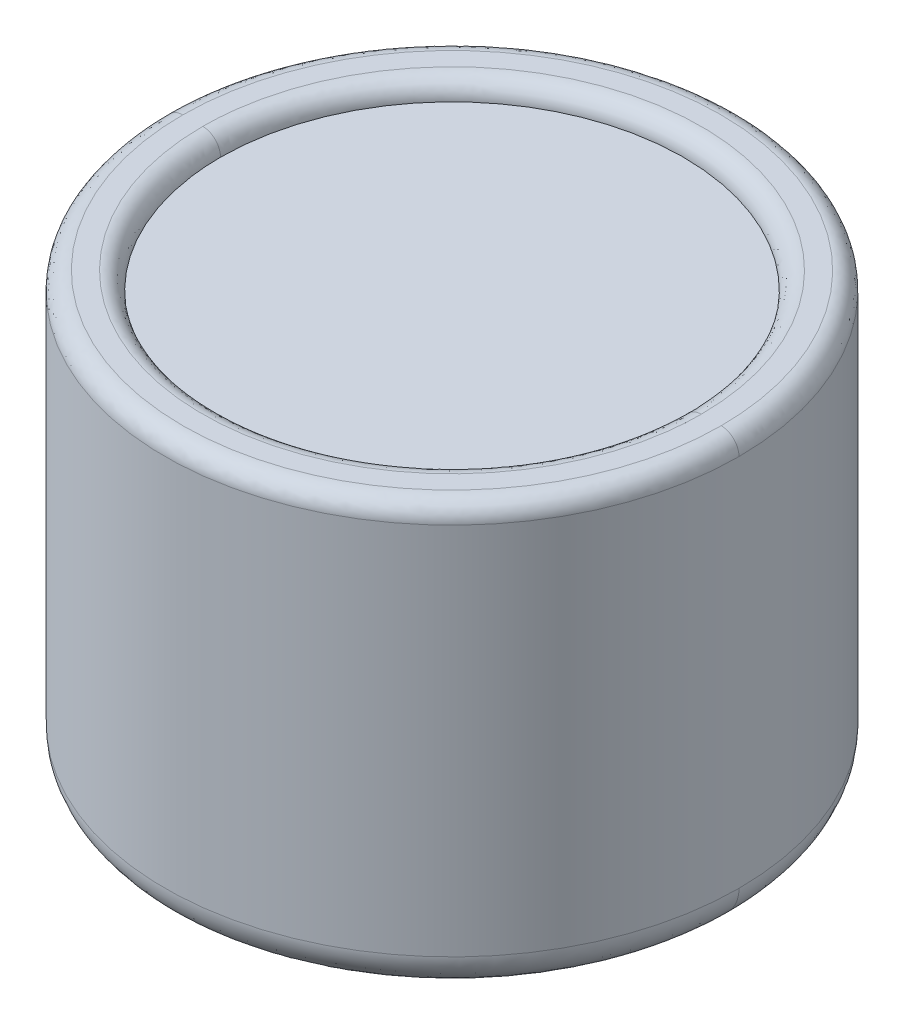
ISO-10303-21;
HEADER;
FILE_DESCRIPTION(('STEP AP214'),'2;1');
FILE_NAME('part.step','',(''),(''),'','','');
FILE_SCHEMA(('AUTOMOTIVE_DESIGN { 1 0 10303 214 1 1 1 1 }'));
ENDSEC;
DATA;
#1=APPLICATION_CONTEXT('core data for automotive mechanical design processes');
#2=APPLICATION_PROTOCOL_DEFINITION('international standard','automotive_design',2000,#1);
#3=PRODUCT_CONTEXT('',#1,'mechanical');
#4=PRODUCT('Part','Part','',(#3));
#5=PRODUCT_RELATED_PRODUCT_CATEGORY('part','',(#4));
#6=PRODUCT_DEFINITION_FORMATION('','',#4);
#7=PRODUCT_DEFINITION_CONTEXT('part definition',#1,'design');
#8=PRODUCT_DEFINITION('design','',#6,#7);
#9=PRODUCT_DEFINITION_SHAPE('','',#8);
#10=(LENGTH_UNIT() NAMED_UNIT(*) SI_UNIT(.MILLI.,.METRE.));
#11=(NAMED_UNIT(*) PLANE_ANGLE_UNIT() SI_UNIT($,.RADIAN.));
#12=(NAMED_UNIT(*) SI_UNIT($,.STERADIAN.) SOLID_ANGLE_UNIT());
#13=UNCERTAINTY_MEASURE_WITH_UNIT(LENGTH_MEASURE(1.E-05),#10,'distance_accuracy_value','');
#14=(GEOMETRIC_REPRESENTATION_CONTEXT(3) GLOBAL_UNCERTAINTY_ASSIGNED_CONTEXT((#13)) GLOBAL_UNIT_ASSIGNED_CONTEXT((#10,
#11,#12)) REPRESENTATION_CONTEXT('',''));
#15=CARTESIAN_POINT('',(0.,0.,0.));
#16=DIRECTION('',(0.,0.,1.));
#17=DIRECTION('',(1.,0.,0.));
#18=AXIS2_PLACEMENT_3D('',#15,#16,#17);
#19=CARTESIAN_POINT('',(-6.578,0.,-6.578));
#20=DIRECTION('',(0.,-1.,0.));
#21=DIRECTION('',(1.,0.,0.));
#22=AXIS2_PLACEMENT_3D('',#19,#20,#21);
#23=PLANE('',#22);
#24=CARTESIAN_POINT('',(6.4999999997338,0.,0.));
#25=CARTESIAN_POINT('',(6.50001366431969,0.,0.167208964565129));
#26=CARTESIAN_POINT('',(6.49354851128327,0.,0.334415483471507));
#27=CARTESIAN_POINT('',(6.46774004786549,0.,0.668080797246167));
#28=CARTESIAN_POINT('',(6.44837770974202,0.,0.834538120950581));
#29=CARTESIAN_POINT('',(6.3965708357251,0.,1.16728617985299));
#30=CARTESIAN_POINT('',(6.363984415412,0.,1.33355484339149));
#31=CARTESIAN_POINT('',(6.28592164803399,0.,1.66308937538702));
#32=CARTESIAN_POINT('',(6.24044149478777,0.,1.82635434198662));
#33=CARTESIAN_POINT('',(6.13682589864649,0.,2.14897606958613));
#34=CARTESIAN_POINT('',(6.07867945412553,0.,2.3083292982214));
#35=CARTESIAN_POINT('',(5.95010992212837,0.,2.62200802602343));
#36=CARTESIAN_POINT('',(5.87968632487843,0.,2.77633331610347));
#37=CARTESIAN_POINT('',(5.7210337373931,0.,3.0908182979343));
#38=CARTESIAN_POINT('',(5.6318445707372,0.,3.25049465806009));
#39=CARTESIAN_POINT('',(5.44032700400565,0.,3.56177490585207));
#40=CARTESIAN_POINT('',(5.33799763986073,0.,3.7133782000583));
#41=CARTESIAN_POINT('',(5.12094953129957,0.,4.00740052136111));
#42=CARTESIAN_POINT('',(5.00623294451055,0.,4.14982114103134));
#43=CARTESIAN_POINT('',(4.76516941006333,0.,4.42454157719982));
#44=CARTESIAN_POINT('',(4.63881841517657,0.,4.55683784223949));
#45=CARTESIAN_POINT('',(4.37546686752828,0.,4.81026741192662));
#46=CARTESIAN_POINT('',(4.23847022605067,0.,4.93140478101395));
#47=CARTESIAN_POINT('',(3.95470814880093,0.,5.1617527090934));
#48=CARTESIAN_POINT('',(3.80793912427279,0.,5.27095884721201));
#49=CARTESIAN_POINT('',(3.50578095423155,0.,5.4765756894931));
#50=CARTESIAN_POINT('',(3.35039522170865,0.,5.57299140919799));
#51=CARTESIAN_POINT('',(3.03199632944103,0.,5.75242593821251));
#52=CARTESIAN_POINT('',(2.86898037490913,0.,5.83543978838135));
#53=CARTESIAN_POINT('',(2.53659430783345,0.,5.98740937566085));
#54=CARTESIAN_POINT('',(2.36722653114135,0.,6.05637022182173));
#55=CARTESIAN_POINT('',(2.02322089272366,0.,6.17980448377659));
#56=CARTESIAN_POINT('',(1.84858110857646,0.,6.23427254199765));
#57=CARTESIAN_POINT('',(1.49539585027405,0.,6.32828365118542));
#58=CARTESIAN_POINT('',(1.316851780365,0.,6.36783197784335));
#59=CARTESIAN_POINT('',(0.957000718837463,0.,6.43176156340239));
#60=CARTESIAN_POINT('',(0.775692734481893,0.,6.45613723453678));
#61=CARTESIAN_POINT('',(0.41170246336448,0.,6.48952198585472));
#62=CARTESIAN_POINT('',(0.229020445580821,0.,6.49853399880751));
#63=CARTESIAN_POINT('',(-0.136457298869431,0.,6.5011364612163));
#64=CARTESIAN_POINT('',(-0.319253027864897,0.,6.49472658368025));
#65=CARTESIAN_POINT('',(-0.683648759991206,0.,6.46653060878248));
#66=CARTESIAN_POINT('',(-0.865248801704446,0.,6.44474501004264));
#67=CARTESIAN_POINT('',(-1.22596811139239,0.,6.38595301567728));
#68=CARTESIAN_POINT('',(-1.40508737946386,0.,6.34894662064545));
#69=CARTESIAN_POINT('',(-1.75957069934756,0.,6.25997638048395));
#70=CARTESIAN_POINT('',(-1.93493477336985,0.,6.20801262384574));
#71=CARTESIAN_POINT('',(-2.28065841955868,0.,6.08949826393411));
#72=CARTESIAN_POINT('',(-2.45101809772229,0.,6.02294796986811));
#73=CARTESIAN_POINT('',(-2.7855675772887,0.,5.87571457987039));
#74=CARTESIAN_POINT('',(-2.94975582870701,0.,5.79502796195797));
#75=CARTESIAN_POINT('',(-3.27069065191145,0.,5.62013938623208));
#76=CARTESIAN_POINT('',(-3.42743993912165,0.,5.52594241136068));
#77=CARTESIAN_POINT('',(-3.73250836581121,0.,5.32464007417811));
#78=CARTESIAN_POINT('',(-3.88082411323613,0.,5.21752957121022));
#79=CARTESIAN_POINT('',(-4.16784964854144,0.,4.99123385434547));
#80=CARTESIAN_POINT('',(-4.30656296173745,0.,4.8720531117676));
#81=CARTESIAN_POINT('',(-4.57349163315597,0.,4.62239949963694));
#82=CARTESIAN_POINT('',(-4.70170432882201,0.,4.49192378325449));
#83=CARTESIAN_POINT('',(-4.94663560166544,0.,4.22068412626734));
#84=CARTESIAN_POINT('',(-5.06335840476437,0.,4.07992400165001));
#85=CARTESIAN_POINT('',(-5.28457800688235,0.,3.7890156994121));
#86=CARTESIAN_POINT('',(-5.38906995183966,0.,3.63886383051852));
#87=CARTESIAN_POINT('',(-5.58499494769155,0.,3.33034699835645));
#88=CARTESIAN_POINT('',(-5.67643281962272,0.,3.17198509676554));
#89=CARTESIAN_POINT('',(-5.84568358745117,0.,2.84805090807281));
#90=CARTESIAN_POINT('',(-5.92349035236186,0.,2.68247541804392));
#91=CARTESIAN_POINT('',(-6.06484826654077,0.,2.34542047929095));
#92=CARTESIAN_POINT('',(-6.12840505410139,0.,2.17394339674015));
#93=CARTESIAN_POINT('',(-6.23675923987154,0.,1.83889698005937));
#94=CARTESIAN_POINT('',(-6.28258453042371,0.,1.67565906014286));
#95=CARTESIAN_POINT('',(-6.36134371919622,0.,1.34610837061257));
#96=CARTESIAN_POINT('',(-6.39427831019976,0.,1.17979576674434));
#97=CARTESIAN_POINT('',(-6.44705407283991,0.,0.845094999023157));
#98=CARTESIAN_POINT('',(-6.46689433202487,0.,0.676706691361722));
#99=CARTESIAN_POINT('',(-6.49337511529671,0.,0.338879764214729));
#100=CARTESIAN_POINT('',(-6.500014401423,0.,0.169441047718414));
#101=CARTESIAN_POINT('',(-6.4999999997338,0.,0.));
#102=B_SPLINE_CURVE_WITH_KNOTS('',3,(#24,#25,#26,#27,#28,#29,#30,#31,#32,#33,#34,#35,#36,#37,
#38,#39,#40,#41,#42,#43,#44,#45,#46,#47,#48,#49,#50,#51,#52,#53,#54,#55,#56,#57,#58,#59,#60,#61,
#62,#63,#64,#65,#66,#67,#68,#69,#70,#71,#72,#73,#74,#75,#76,#77,#78,#79,#80,#81,#82,#83,#84,#85,
#86,#87,#88,#89,#90,#91,#92,#93,#94,#95,#96,#97,#98,#99,#100,#101),.UNSPECIFIED.,.F.,.F.,(4,2,2,
2,2,2,2,2,2,2,2,2,2,2,2,2,2,2,2,2,2,2,2,2,2,2,2,2,2,2,2,2,2,2,2,2,2,2,4),(0.,0.50149818635042,
1.0037378970121,1.51151506612574,2.01944228550024,2.5278124495479,3.03620372724625,
3.58423558241575,4.13230766855352,4.68028444409916,5.22845256816133,5.77642023516014,
6.32459025665536,6.87254468327879,7.42070140894743,7.96865849215657,8.51681785902234,
9.06478321192487,9.61295024961197,10.1610126359527,10.709086643023,11.2571428773242,
11.8051990902483,12.3532520608027,12.9012934147786,13.4494715046606,13.9974479308252,
14.5456432218957,15.0936361762939,15.641767653385,16.1896967714184,16.7378426140704,
17.2857854928316,17.8339741956059,18.3819456121217,18.8900794611449,19.3981859978455,
19.9063279371706,20.4145175267733),.UNSPECIFIED.);
#103=CARTESIAN_POINT('',(6.4999999997338,0.,0.));
#104=VERTEX_POINT('',#103);
#105=CARTESIAN_POINT('',(-6.4999999997338,2.78870829823793E-10,0.));
#106=VERTEX_POINT('',#105);
#107=EDGE_CURVE('E72',#104,#106,#102,.T.);
#108=ORIENTED_EDGE('',*,*,#107,.F.);
#109=CARTESIAN_POINT('',(-6.4999999997338,0.,0.));
#110=CARTESIAN_POINT('',(-6.50001366431969,0.,-0.167208964565129));
#111=CARTESIAN_POINT('',(-6.49354851128327,0.,-0.334415483471507));
#112=CARTESIAN_POINT('',(-6.46774004786549,0.,-0.668080797246167));
#113=CARTESIAN_POINT('',(-6.44837770974202,0.,-0.834538120950581));
#114=CARTESIAN_POINT('',(-6.3965708357251,0.,-1.16728617985299));
#115=CARTESIAN_POINT('',(-6.363984415412,0.,-1.33355484339149));
#116=CARTESIAN_POINT('',(-6.28592164803399,0.,-1.66308937538702));
#117=CARTESIAN_POINT('',(-6.24044149478777,0.,-1.82635434198662));
#118=CARTESIAN_POINT('',(-6.13682589864649,0.,-2.14897606958613));
#119=CARTESIAN_POINT('',(-6.07867945412553,0.,-2.3083292982214));
#120=CARTESIAN_POINT('',(-5.95010992212837,0.,-2.62200802602343));
#121=CARTESIAN_POINT('',(-5.87968632487843,0.,-2.77633331610347));
#122=CARTESIAN_POINT('',(-5.7210337373931,0.,-3.0908182979343));
#123=CARTESIAN_POINT('',(-5.6318445707372,0.,-3.25049465806009));
#124=CARTESIAN_POINT('',(-5.44032700400565,0.,-3.56177490585207));
#125=CARTESIAN_POINT('',(-5.33799763986073,0.,-3.7133782000583));
#126=CARTESIAN_POINT('',(-5.12094953129957,0.,-4.00740052136111));
#127=CARTESIAN_POINT('',(-5.00623294451055,0.,-4.14982114103134));
#128=CARTESIAN_POINT('',(-4.76516941006333,0.,-4.42454157719982));
#129=CARTESIAN_POINT('',(-4.63881841517657,0.,-4.55683784223949));
#130=CARTESIAN_POINT('',(-4.37546686752828,0.,-4.81026741192662));
#131=CARTESIAN_POINT('',(-4.23847022605067,0.,-4.93140478101395));
#132=CARTESIAN_POINT('',(-3.95470814880093,0.,-5.1617527090934));
#133=CARTESIAN_POINT('',(-3.80793912427279,0.,-5.27095884721201));
#134=CARTESIAN_POINT('',(-3.50578095423155,0.,-5.4765756894931));
#135=CARTESIAN_POINT('',(-3.35039522170865,0.,-5.57299140919799));
#136=CARTESIAN_POINT('',(-3.03199632944103,0.,-5.75242593821251));
#137=CARTESIAN_POINT('',(-2.86898037490913,0.,-5.83543978838135));
#138=CARTESIAN_POINT('',(-2.53659430783345,0.,-5.98740937566085));
#139=CARTESIAN_POINT('',(-2.36722653114135,0.,-6.05637022182173));
#140=CARTESIAN_POINT('',(-2.02322089272366,0.,-6.17980448377659));
#141=CARTESIAN_POINT('',(-1.84858110857646,0.,-6.23427254199765));
#142=CARTESIAN_POINT('',(-1.49539585027405,0.,-6.32828365118542));
#143=CARTESIAN_POINT('',(-1.316851780365,0.,-6.36783197784335));
#144=CARTESIAN_POINT('',(-0.957000718837463,0.,-6.43176156340239));
#145=CARTESIAN_POINT('',(-0.775692734481893,0.,-6.45613723453678));
#146=CARTESIAN_POINT('',(-0.41170246336448,0.,-6.48952198585472));
#147=CARTESIAN_POINT('',(-0.229020445580821,0.,-6.49853399880751));
#148=CARTESIAN_POINT('',(0.136457298869431,0.,-6.5011364612163));
#149=CARTESIAN_POINT('',(0.319253027864897,0.,-6.49472658368025));
#150=CARTESIAN_POINT('',(0.683648759991206,0.,-6.46653060878248));
#151=CARTESIAN_POINT('',(0.865248801704446,0.,-6.44474501004264));
#152=CARTESIAN_POINT('',(1.22596811139239,0.,-6.38595301567728));
#153=CARTESIAN_POINT('',(1.40508737946386,0.,-6.34894662064545));
#154=CARTESIAN_POINT('',(1.75957069934756,0.,-6.25997638048395));
#155=CARTESIAN_POINT('',(1.93493477336985,0.,-6.20801262384574));
#156=CARTESIAN_POINT('',(2.28065841955868,0.,-6.08949826393411));
#157=CARTESIAN_POINT('',(2.45101809772229,0.,-6.02294796986811));
#158=CARTESIAN_POINT('',(2.7855675772887,0.,-5.87571457987039));
#159=CARTESIAN_POINT('',(2.94975582870701,0.,-5.79502796195797));
#160=CARTESIAN_POINT('',(3.27069065191145,0.,-5.62013938623208));
#161=CARTESIAN_POINT('',(3.42743993912165,0.,-5.52594241136068));
#162=CARTESIAN_POINT('',(3.73250836581121,0.,-5.32464007417811));
#163=CARTESIAN_POINT('',(3.88082411323613,0.,-5.21752957121022));
#164=CARTESIAN_POINT('',(4.16784964854144,0.,-4.99123385434547));
#165=CARTESIAN_POINT('',(4.30656296173745,0.,-4.8720531117676));
#166=CARTESIAN_POINT('',(4.57349163315597,0.,-4.62239949963694));
#167=CARTESIAN_POINT('',(4.70170432882201,0.,-4.49192378325449));
#168=CARTESIAN_POINT('',(4.94663560166544,0.,-4.22068412626734));
#169=CARTESIAN_POINT('',(5.06335840476437,0.,-4.07992400165001));
#170=CARTESIAN_POINT('',(5.28457800688235,0.,-3.7890156994121));
#171=CARTESIAN_POINT('',(5.38906995183966,0.,-3.63886383051852));
#172=CARTESIAN_POINT('',(5.58499494769155,0.,-3.33034699835645));
#173=CARTESIAN_POINT('',(5.67643281962272,0.,-3.17198509676554));
#174=CARTESIAN_POINT('',(5.84568358745117,0.,-2.84805090807281));
#175=CARTESIAN_POINT('',(5.92349035236186,0.,-2.68247541804392));
#176=CARTESIAN_POINT('',(6.06484826654077,0.,-2.34542047929095));
#177=CARTESIAN_POINT('',(6.12840505410139,0.,-2.17394339674015));
#178=CARTESIAN_POINT('',(6.23675923987154,0.,-1.83889698005937));
#179=CARTESIAN_POINT('',(6.28258453042371,0.,-1.67565906014286));
#180=CARTESIAN_POINT('',(6.36134371919622,0.,-1.34610837061257));
#181=CARTESIAN_POINT('',(6.39427831019976,0.,-1.17979576674434));
#182=CARTESIAN_POINT('',(6.44705407283991,0.,-0.845094999023157));
#183=CARTESIAN_POINT('',(6.46689433202487,0.,-0.676706691361722));
#184=CARTESIAN_POINT('',(6.49337511529671,0.,-0.338879764214729));
#185=CARTESIAN_POINT('',(6.500014401423,0.,-0.169441047718414));
#186=CARTESIAN_POINT('',(6.4999999997338,0.,0.));
#187=B_SPLINE_CURVE_WITH_KNOTS('',3,(#109,#110,#111,#112,#113,#114,#115,#116,#117,#118,#119,
#120,#121,#122,#123,#124,#125,#126,#127,#128,#129,#130,#131,#132,#133,#134,#135,#136,#137,#138,
#139,#140,#141,#142,#143,#144,#145,#146,#147,#148,#149,#150,#151,#152,#153,#154,#155,#156,#157,
#158,#159,#160,#161,#162,#163,#164,#165,#166,#167,#168,#169,#170,#171,#172,#173,#174,#175,#176,
#177,#178,#179,#180,#181,#182,#183,#184,#185,#186),.UNSPECIFIED.,.F.,.F.,(4,2,2,2,2,2,2,2,2,2,2,
2,2,2,2,2,2,2,2,2,2,2,2,2,2,2,2,2,2,2,2,2,2,2,2,2,2,2,4),(0.,0.50149818635042,1.0037378970121,
1.51151506612574,2.01944228550024,2.5278124495479,3.03620372724625,3.58423558241575,
4.13230766855352,4.68028444409916,5.22845256816133,5.77642023516014,6.32459025665536,
6.87254468327879,7.42070140894743,7.96865849215657,8.51681785902234,9.06478321192487,
9.61295024961197,10.1610126359527,10.709086643023,11.2571428773242,11.8051990902483,
12.3532520608027,12.9012934147786,13.4494715046606,13.9974479308252,14.5456432218957,
15.0936361762939,15.641767653385,16.1896967714184,16.7378426140704,17.2857854928316,
17.8339741956059,18.3819456121217,18.8900794611449,19.3981859978455,19.9063279371706,
20.4145175267733),.UNSPECIFIED.);
#188=EDGE_CURVE('E20',#106,#104,#187,.T.);
#189=ORIENTED_EDGE('',*,*,#188,.F.);
#190=EDGE_LOOP('',(#108,#189));
#191=FACE_BOUND('',#190,.T.);
#192=ADVANCED_FACE('F16',(#191),#23,.F.);
#193=CARTESIAN_POINT('',(-7.049916708,0.497502083,0.));
#194=CARTESIAN_POINT('',(-7.049916708,0.497502083,-14.099833417));
#195=CARTESIAN_POINT('',(7.049916708,0.497502083,-14.099833417));
#196=CARTESIAN_POINT('',(7.049916708,0.497502083,0.));
#197=CARTESIAN_POINT('',(-6.709973117,0.531610211,0.));
#198=CARTESIAN_POINT('',(-6.709973117,0.531610211,-13.419946235));
#199=CARTESIAN_POINT('',(6.709973117,0.531610211,-13.419946235));
#200=CARTESIAN_POINT('',(6.709973117,0.531610211,0.));
#201=CARTESIAN_POINT('',(-6.468389789,0.290026883,0.));
#202=CARTESIAN_POINT('',(-6.468389789,0.290026883,-12.936779577));
#203=CARTESIAN_POINT('',(6.468389789,0.290026883,-12.936779577));
#204=CARTESIAN_POINT('',(6.468389789,0.290026883,0.));
#205=CARTESIAN_POINT('',(-6.502497917,-0.049916708,0.));
#206=CARTESIAN_POINT('',(-6.502497917,-0.049916708,-13.004995835));
#207=CARTESIAN_POINT('',(6.502497917,-0.049916708,-13.004995835));
#208=CARTESIAN_POINT('',(6.502497917,-0.049916708,0.));
#209=(BOUNDED_SURFACE() B_SPLINE_SURFACE(3,3,((#193,#194,#195,#196),(#197,#198,#199,#200),(#201,
#202,#203,#204),(#205,#206,#207,#208)),.UNSPECIFIED.,.F.,.F.,
.F.) B_SPLINE_SURFACE_WITH_KNOTS((4,4),(4,4),(0.,1.),(0.,1.),
.UNSPECIFIED.) GEOMETRIC_REPRESENTATION_ITEM() RATIONAL_B_SPLINE_SURFACE(((1.,0.333333333333333,
0.333333333333333,1.),(0.755320871117972,0.251773623705991,0.251773623705991,0.755320871117972),
(0.755320871117972,0.251773623705991,0.251773623705991,0.755320871117972),(1.,0.333333333333333,
0.333333333333333,1.))) REPRESENTATION_ITEM('') SURFACE());
#210=CARTESIAN_POINT('',(7.049916708,0.497502083,0.));
#211=CARTESIAN_POINT('',(6.709973117,0.531610211,0.));
#212=CARTESIAN_POINT('',(6.468389789,0.290026883,0.));
#213=CARTESIAN_POINT('',(6.502497917,-0.049916708,0.));
#214=(BOUNDED_CURVE() B_SPLINE_CURVE(3,(#210,#211,#212,#213),.UNSPECIFIED.,.F.,
.F.) B_SPLINE_CURVE_WITH_KNOTS((4,4),(0.,1.),
.UNSPECIFIED.) CURVE() GEOMETRIC_REPRESENTATION_ITEM() RATIONAL_B_SPLINE_CURVE((1.,
0.755320871117972,0.755320871117972,1.)) REPRESENTATION_ITEM(''));
#215=CARTESIAN_POINT('',(7.00000000225801,0.500000000159717,0.));
#216=VERTEX_POINT('',#215);
#217=EDGE_CURVE('E79',#216,#104,#214,.T.);
#218=CARTESIAN_POINT('',(6.99999999919493,0.500000000266195,0.));
#219=CARTESIAN_POINT('',(6.99999999919493,0.500000000266195,-13.9999999993722));
#220=CARTESIAN_POINT('',(-6.99999999919493,0.500000000266195,-13.9999999993722));
#221=CARTESIAN_POINT('',(-6.99999999919493,0.500000000266195,0.));
#222=(BOUNDED_CURVE() B_SPLINE_CURVE(3,(#218,#219,#220,#221),.UNSPECIFIED.,.F.,
.F.) B_SPLINE_CURVE_WITH_KNOTS((4,4),(0.,1.),
.UNSPECIFIED.) CURVE() GEOMETRIC_REPRESENTATION_ITEM() RATIONAL_B_SPLINE_CURVE((0.956578301969994,
0.318859433989998,0.318859433989998,0.956578301969994)) REPRESENTATION_ITEM(''));
#223=CARTESIAN_POINT('',(-7.00000000225801,0.500000000159717,0.));
#224=VERTEX_POINT('',#223);
#225=EDGE_CURVE('E86',#216,#224,#222,.T.);
#226=CARTESIAN_POINT('',(-7.049916708,0.497502083,0.));
#227=CARTESIAN_POINT('',(-6.709973117,0.531610211,0.));
#228=CARTESIAN_POINT('',(-6.468389789,0.290026883,0.));
#229=CARTESIAN_POINT('',(-6.502497917,-0.049916708,0.));
#230=(BOUNDED_CURVE() B_SPLINE_CURVE(3,(#226,#227,#228,#229),.UNSPECIFIED.,.F.,
.F.) B_SPLINE_CURVE_WITH_KNOTS((4,4),(0.,1.),
.UNSPECIFIED.) CURVE() GEOMETRIC_REPRESENTATION_ITEM() RATIONAL_B_SPLINE_CURVE((1.,
0.755320871117972,0.755320871117972,1.)) REPRESENTATION_ITEM(''));
#231=EDGE_CURVE('E76',#106,#224,#230,.F.);
#232=ORIENTED_EDGE('',*,*,#217,.F.);
#233=ORIENTED_EDGE('',*,*,#225,.T.);
#234=ORIENTED_EDGE('',*,*,#231,.F.);
#235=ORIENTED_EDGE('',*,*,#188,.T.);
#236=EDGE_LOOP('',(#232,#233,#234,#235));
#237=FACE_BOUND('',#236,.T.);
#238=ADVANCED_FACE('F78',(#237),#209,.T.);
#239=CARTESIAN_POINT('',(7.049916708,0.497502083,0.));
#240=CARTESIAN_POINT('',(7.049916708,0.497502083,14.099833417));
#241=CARTESIAN_POINT('',(-7.049916708,0.497502083,14.099833417));
#242=CARTESIAN_POINT('',(-7.049916708,0.497502083,0.));
#243=CARTESIAN_POINT('',(6.709973117,0.531610211,0.));
#244=CARTESIAN_POINT('',(6.709973117,0.531610211,13.419946235));
#245=CARTESIAN_POINT('',(-6.709973117,0.531610211,13.419946235));
#246=CARTESIAN_POINT('',(-6.709973117,0.531610211,0.));
#247=CARTESIAN_POINT('',(6.468389789,0.290026883,0.));
#248=CARTESIAN_POINT('',(6.468389789,0.290026883,12.936779577));
#249=CARTESIAN_POINT('',(-6.468389789,0.290026883,12.936779577));
#250=CARTESIAN_POINT('',(-6.468389789,0.290026883,0.));
#251=CARTESIAN_POINT('',(6.502497917,-0.049916708,0.));
#252=CARTESIAN_POINT('',(6.502497917,-0.049916708,13.004995835));
#253=CARTESIAN_POINT('',(-6.502497917,-0.049916708,13.004995835));
#254=CARTESIAN_POINT('',(-6.502497917,-0.049916708,0.));
#255=(BOUNDED_SURFACE() B_SPLINE_SURFACE(3,3,((#239,#240,#241,#242),(#243,#244,#245,#246),(#247,
#248,#249,#250),(#251,#252,#253,#254)),.UNSPECIFIED.,.F.,.F.,
.F.) B_SPLINE_SURFACE_WITH_KNOTS((4,4),(4,4),(0.,1.),(0.,1.),
.UNSPECIFIED.) GEOMETRIC_REPRESENTATION_ITEM() RATIONAL_B_SPLINE_SURFACE(((1.,0.333333333333333,
0.333333333333333,1.),(0.755320871117972,0.251773623705991,0.251773623705991,0.755320871117972),
(0.755320871117972,0.251773623705991,0.251773623705991,0.755320871117972),(1.,0.333333333333333,
0.333333333333333,1.))) REPRESENTATION_ITEM('') SURFACE());
#256=CARTESIAN_POINT('',(-6.99999999919493,0.500000000266195,0.));
#257=CARTESIAN_POINT('',(-6.99999999919493,0.500000000266195,13.9999999993722));
#258=CARTESIAN_POINT('',(6.99999999919493,0.500000000266195,13.9999999993722));
#259=CARTESIAN_POINT('',(6.99999999919493,0.500000000266195,0.));
#260=(BOUNDED_CURVE() B_SPLINE_CURVE(3,(#256,#257,#258,#259),.UNSPECIFIED.,.F.,
.F.) B_SPLINE_CURVE_WITH_KNOTS((4,4),(0.,1.),
.UNSPECIFIED.) CURVE() GEOMETRIC_REPRESENTATION_ITEM() RATIONAL_B_SPLINE_CURVE((0.956578301969994,
0.318859433989998,0.318859433989998,0.956578301969994)) REPRESENTATION_ITEM(''));
#261=EDGE_CURVE('E83',#224,#216,#260,.T.);
#262=ORIENTED_EDGE('',*,*,#261,.T.);
#263=ORIENTED_EDGE('',*,*,#217,.T.);
#264=ORIENTED_EDGE('',*,*,#107,.T.);
#265=ORIENTED_EDGE('',*,*,#231,.T.);
#266=EDGE_LOOP('',(#262,#263,#264,#265));
#267=FACE_BOUND('',#266,.T.);
#268=ADVANCED_FACE('F81',(#267),#255,.T.);
#269=CARTESIAN_POINT('',(-7.65072,0.5,-7.65072));
#270=DIRECTION('',(0.,-1.,0.));
#271=DIRECTION('',(1.,0.,0.));
#272=AXIS2_PLACEMENT_3D('',#269,#270,#271);
#273=PLANE('',#272);
#274=ORIENTED_EDGE('',*,*,#225,.F.);
#275=ORIENTED_EDGE('',*,*,#261,.F.);
#276=EDGE_LOOP('',(#274,#275));
#277=FACE_BOUND('',#276,.T.);
#278=CARTESIAN_POINT('',(7.56000000080507,0.500000000266195,0.));
#279=CARTESIAN_POINT('',(7.56000000080507,0.500000000266195,15.1200000006278));
#280=CARTESIAN_POINT('',(-7.56000000080507,0.500000000266195,15.1200000006278));
#281=CARTESIAN_POINT('',(-7.56000000080507,0.500000000266195,0.));
#282=(BOUNDED_CURVE() B_SPLINE_CURVE(3,(#278,#279,#280,#281),.UNSPECIFIED.,.F.,
.F.) B_SPLINE_CURVE_WITH_KNOTS((4,4),(0.,1.),
.UNSPECIFIED.) CURVE() GEOMETRIC_REPRESENTATION_ITEM() RATIONAL_B_SPLINE_CURVE((0.956578301969997,
0.318859433989999,0.318859433989999,0.956578301969997)) REPRESENTATION_ITEM(''));
#283=CARTESIAN_POINT('',(7.55999999893367,0.500000000159717,0.));
#284=VERTEX_POINT('',#283);
#285=CARTESIAN_POINT('',(-7.55999999893367,0.500000000159717,0.));
#286=VERTEX_POINT('',#285);
#287=EDGE_CURVE('E163',#284,#286,#282,.T.);
#288=ORIENTED_EDGE('',*,*,#287,.F.);
#289=CARTESIAN_POINT('',(-7.56000000080507,0.500000000266195,0.));
#290=CARTESIAN_POINT('',(-7.56000000080507,0.500000000266195,-15.1200000006278));
#291=CARTESIAN_POINT('',(7.56000000080507,0.500000000266195,-15.1200000006278));
#292=CARTESIAN_POINT('',(7.56000000080507,0.500000000266195,0.));
#293=(BOUNDED_CURVE() B_SPLINE_CURVE(3,(#289,#290,#291,#292),.UNSPECIFIED.,.F.,
.F.) B_SPLINE_CURVE_WITH_KNOTS((4,4),(0.,1.),
.UNSPECIFIED.) CURVE() GEOMETRIC_REPRESENTATION_ITEM() RATIONAL_B_SPLINE_CURVE((0.956578301969996,
0.318859433989999,0.318859433989999,0.956578301969996)) REPRESENTATION_ITEM(''));
#294=EDGE_CURVE('E151',#286,#284,#293,.T.);
#295=ORIENTED_EDGE('',*,*,#294,.F.);
#296=EDGE_LOOP('',(#288,#295));
#297=FACE_BOUND('',#296,.T.);
#298=ADVANCED_FACE('F128',(#277,#297),#273,.F.);
#299=CARTESIAN_POINT('',(-8.057502083,-0.049916708,0.));
#300=CARTESIAN_POINT('',(-8.057502083,-0.049916708,-16.115004165));
#301=CARTESIAN_POINT('',(8.057502083,-0.049916708,-16.115004165));
#302=CARTESIAN_POINT('',(8.057502083,-0.049916708,0.));
#303=CARTESIAN_POINT('',(-8.091610211,0.290026883,0.));
#304=CARTESIAN_POINT('',(-8.091610211,0.290026883,-16.183220423));
#305=CARTESIAN_POINT('',(8.091610211,0.290026883,-16.183220423));
#306=CARTESIAN_POINT('',(8.091610211,0.290026883,0.));
#307=CARTESIAN_POINT('',(-7.850026883,0.531610211,0.));
#308=CARTESIAN_POINT('',(-7.850026883,0.531610211,-15.700053765));
#309=CARTESIAN_POINT('',(7.850026883,0.531610211,-15.700053765));
#310=CARTESIAN_POINT('',(7.850026883,0.531610211,0.));
#311=CARTESIAN_POINT('',(-7.510083292,0.497502083,0.));
#312=CARTESIAN_POINT('',(-7.510083292,0.497502083,-15.020166583));
#313=CARTESIAN_POINT('',(7.510083292,0.497502083,-15.020166583));
#314=CARTESIAN_POINT('',(7.510083292,0.497502083,0.));
#315=(BOUNDED_SURFACE() B_SPLINE_SURFACE(3,3,((#299,#300,#301,#302),(#303,#304,#305,#306),(#307,
#308,#309,#310),(#311,#312,#313,#314)),.UNSPECIFIED.,.F.,.F.,
.F.) B_SPLINE_SURFACE_WITH_KNOTS((4,4),(4,4),(0.,1.),(0.,1.),
.UNSPECIFIED.) GEOMETRIC_REPRESENTATION_ITEM() RATIONAL_B_SPLINE_SURFACE(((1.,0.333333333333333,
0.333333333333333,1.),(0.755320871117972,0.251773623705991,0.251773623705991,0.755320871117972),
(0.755320871117972,0.251773623705991,0.251773623705991,0.755320871117972),(1.,0.333333333333333,
0.333333333333333,1.))) REPRESENTATION_ITEM('') SURFACE());
#316=CARTESIAN_POINT('',(8.057502083,-0.049916708,0.));
#317=CARTESIAN_POINT('',(8.091610211,0.290026883,0.));
#318=CARTESIAN_POINT('',(7.850026883,0.531610211,0.));
#319=CARTESIAN_POINT('',(7.510083292,0.497502083,0.));
#320=(BOUNDED_CURVE() B_SPLINE_CURVE(3,(#316,#317,#318,#319),.UNSPECIFIED.,.F.,
.F.) B_SPLINE_CURVE_WITH_KNOTS((4,4),(0.,1.),
.UNSPECIFIED.) CURVE() GEOMETRIC_REPRESENTATION_ITEM() RATIONAL_B_SPLINE_CURVE((1.,
0.755320871117972,0.755320871117972,1.)) REPRESENTATION_ITEM(''));
#321=CARTESIAN_POINT('',(8.06000000019965,4.18306233210587E-10,-8.26566816916785E-10));
#322=VERTEX_POINT('',#321);
#323=EDGE_CURVE('E256',#322,#284,#320,.T.);
#324=CARTESIAN_POINT('',(0.,0.,0.));
#325=DIRECTION('',(0.,1.,0.));
#326=DIRECTION('',(-1.,0.,0.));
#327=AXIS2_PLACEMENT_3D('',#324,#325,#326);
#328=CIRCLE('',#327,8.06);
#329=CARTESIAN_POINT('',(-8.06000000016637,3.48588527300774E-10,-3.61868322567794E-10));
#330=VERTEX_POINT('',#329);
#331=EDGE_CURVE('E202',#322,#330,#328,.T.);
#332=CARTESIAN_POINT('',(-8.057502083,-0.049916708,0.));
#333=CARTESIAN_POINT('',(-8.091610211,0.290026883,0.));
#334=CARTESIAN_POINT('',(-7.850026883,0.531610211,0.));
#335=CARTESIAN_POINT('',(-7.510083292,0.497502083,0.));
#336=(BOUNDED_CURVE() B_SPLINE_CURVE(3,(#332,#333,#334,#335),.UNSPECIFIED.,.F.,
.F.) B_SPLINE_CURVE_WITH_KNOTS((4,4),(0.,1.),
.UNSPECIFIED.) CURVE() GEOMETRIC_REPRESENTATION_ITEM() RATIONAL_B_SPLINE_CURVE((1.,
0.755320871117972,0.755320871117972,1.)) REPRESENTATION_ITEM(''));
#337=EDGE_CURVE('E263',#286,#330,#336,.F.);
#338=ORIENTED_EDGE('',*,*,#323,.F.);
#339=ORIENTED_EDGE('',*,*,#331,.T.);
#340=ORIENTED_EDGE('',*,*,#337,.F.);
#341=ORIENTED_EDGE('',*,*,#294,.T.);
#342=EDGE_LOOP('',(#338,#339,#340,#341));
#343=FACE_BOUND('',#342,.T.);
#344=ADVANCED_FACE('F210',(#343),#315,.T.);
#345=CARTESIAN_POINT('',(8.055004165,-10.400166583,0.));
#346=CARTESIAN_POINT('',(8.055004165,-10.400166583,-16.110008331));
#347=CARTESIAN_POINT('',(-8.055004165,-10.400166583,-16.110008331));
#348=CARTESIAN_POINT('',(-8.055004165,-10.400166583,0.));
#349=CARTESIAN_POINT('',(8.123220423,-11.080053765,0.));
#350=CARTESIAN_POINT('',(8.123220423,-11.080053765,-16.246440845));
#351=CARTESIAN_POINT('',(-8.123220423,-11.080053765,-16.246440845));
#352=CARTESIAN_POINT('',(-8.123220423,-11.080053765,0.));
#353=CARTESIAN_POINT('',(7.640053765,-11.563220423,0.));
#354=CARTESIAN_POINT('',(7.640053765,-11.563220423,-15.28010753));
#355=CARTESIAN_POINT('',(-7.640053765,-11.563220423,-15.28010753));
#356=CARTESIAN_POINT('',(-7.640053765,-11.563220423,0.));
#357=CARTESIAN_POINT('',(6.960166583,-11.495004165,0.));
#358=CARTESIAN_POINT('',(6.960166583,-11.495004165,-13.920333167));
#359=CARTESIAN_POINT('',(-6.960166583,-11.495004165,-13.920333167));
#360=CARTESIAN_POINT('',(-6.960166583,-11.495004165,0.));
#361=(BOUNDED_SURFACE() B_SPLINE_SURFACE(3,3,((#345,#346,#347,#348),(#349,#350,#351,#352),(#353,
#354,#355,#356),(#357,#358,#359,#360)),.UNSPECIFIED.,.F.,.F.,
.F.) B_SPLINE_SURFACE_WITH_KNOTS((4,4),(4,4),(0.,1.),(0.,1.),
.UNSPECIFIED.) GEOMETRIC_REPRESENTATION_ITEM() RATIONAL_B_SPLINE_SURFACE(((1.,0.333333333333333,
0.333333333333333,1.),(0.755320871117972,0.251773623705991,0.251773623705991,0.755320871117972),
(0.755320871117972,0.251773623705991,0.251773623705991,0.755320871117972),(1.,0.333333333333333,
0.333333333333333,1.))) REPRESENTATION_ITEM('') SURFACE());
#362=CARTESIAN_POINT('',(-8.055004165,-10.400166583,0.));
#363=CARTESIAN_POINT('',(-8.123220423,-11.080053765,0.));
#364=CARTESIAN_POINT('',(-7.640053765,-11.563220423,0.));
#365=CARTESIAN_POINT('',(-6.960166583,-11.495004165,0.));
#366=(BOUNDED_CURVE() B_SPLINE_CURVE(3,(#362,#363,#364,#365),.UNSPECIFIED.,.F.,
.F.) B_SPLINE_CURVE_WITH_KNOTS((4,4),(0.,1.),
.UNSPECIFIED.) CURVE() GEOMETRIC_REPRESENTATION_ITEM() RATIONAL_B_SPLINE_CURVE((1.,
0.755320871117972,0.755320871117972,1.)) REPRESENTATION_ITEM(''));
#367=CARTESIAN_POINT('',(-7.06000000006659,-11.4999999998718,0.));
#368=VERTEX_POINT('',#367);
#369=CARTESIAN_POINT('',(-8.05999999979495,-10.5000000000832,0.));
#370=VERTEX_POINT('',#369);
#371=EDGE_CURVE('E40',#368,#370,#366,.F.);
#372=CARTESIAN_POINT('',(0.,-10.5,0.));
#373=DIRECTION('',(0.,1.,0.));
#374=DIRECTION('',(-1.,0.,0.));
#375=AXIS2_PLACEMENT_3D('',#372,#373,#374);
#376=CIRCLE('',#375,8.06);
#377=CARTESIAN_POINT('',(8.0599999998633,-10.5000000000721,-8.26566816919413E-10));
#378=VERTEX_POINT('',#377);
#379=EDGE_CURVE('E139',#370,#378,#376,.F.);
#380=CARTESIAN_POINT('',(8.055004165,-10.400166583,0.));
#381=CARTESIAN_POINT('',(8.123220423,-11.080053765,0.));
#382=CARTESIAN_POINT('',(7.640053765,-11.563220423,0.));
#383=CARTESIAN_POINT('',(6.960166583,-11.495004165,0.));
#384=(BOUNDED_CURVE() B_SPLINE_CURVE(3,(#380,#381,#382,#383),.UNSPECIFIED.,.F.,
.F.) B_SPLINE_CURVE_WITH_KNOTS((4,4),(0.,1.),
.UNSPECIFIED.) CURVE() GEOMETRIC_REPRESENTATION_ITEM() RATIONAL_B_SPLINE_CURVE((1.,
0.755320871117972,0.755320871117972,1.)) REPRESENTATION_ITEM(''));
#385=CARTESIAN_POINT('',(7.06000000006659,-11.4999999998718,-1.81003775665121E-09));
#386=VERTEX_POINT('',#385);
#387=EDGE_CURVE('E180',#378,#386,#384,.T.);
#388=CARTESIAN_POINT('',(0.,-11.5,0.));
#389=DIRECTION('',(0.,1.,0.));
#390=DIRECTION('',(-1.,0.,0.));
#391=AXIS2_PLACEMENT_3D('',#388,#389,#390);
#392=CIRCLE('',#391,7.06);
#393=EDGE_CURVE('E187',#368,#386,#392,.F.);
#394=ORIENTED_EDGE('',*,*,#371,.T.);
#395=ORIENTED_EDGE('',*,*,#379,.T.);
#396=ORIENTED_EDGE('',*,*,#387,.T.);
#397=ORIENTED_EDGE('',*,*,#393,.F.);
#398=EDGE_LOOP('',(#394,#395,#396,#397));
#399=FACE_BOUND('',#398,.T.);
#400=ADVANCED_FACE('F221',(#399),#361,.T.);
#401=CARTESIAN_POINT('',(-7.14472,-0.5,-7.14472));
#402=DIRECTION('',(0.,-1.,0.));
#403=DIRECTION('',(1.,0.,0.));
#404=AXIS2_PLACEMENT_3D('',#401,#402,#403);
#405=PLANE('',#404);
#406=CARTESIAN_POINT('',(0.,-0.5,0.));
#407=DIRECTION('',(0.,1.,0.));
#408=DIRECTION('',(0.,0.,1.));
#409=AXIS2_PLACEMENT_3D('',#406,#407,#408);
#410=CIRCLE('',#409,7.06);
#411=CARTESIAN_POINT('',(0.,-0.5,7.06));
#412=VERTEX_POINT('',#411);
#413=EDGE_CURVE('E135',#412,#412,#410,.T.);
#414=ORIENTED_EDGE('',*,*,#413,.F.);
#415=EDGE_LOOP('',(#414));
#416=FACE_BOUND('',#415,.T.);
#417=ADVANCED_FACE('F18',(#416),#405,.T.);
#418=CARTESIAN_POINT('',(8.057502083,-0.049916708,0.));
#419=CARTESIAN_POINT('',(8.057502083,-0.049916708,16.115004165));
#420=CARTESIAN_POINT('',(-8.057502083,-0.049916708,16.115004165));
#421=CARTESIAN_POINT('',(-8.057502083,-0.049916708,0.));
#422=CARTESIAN_POINT('',(8.091610211,0.290026883,0.));
#423=CARTESIAN_POINT('',(8.091610211,0.290026883,16.183220423));
#424=CARTESIAN_POINT('',(-8.091610211,0.290026883,16.183220423));
#425=CARTESIAN_POINT('',(-8.091610211,0.290026883,0.));
#426=CARTESIAN_POINT('',(7.850026883,0.531610211,0.));
#427=CARTESIAN_POINT('',(7.850026883,0.531610211,15.700053765));
#428=CARTESIAN_POINT('',(-7.850026883,0.531610211,15.700053765));
#429=CARTESIAN_POINT('',(-7.850026883,0.531610211,0.));
#430=CARTESIAN_POINT('',(7.510083292,0.497502083,0.));
#431=CARTESIAN_POINT('',(7.510083292,0.497502083,15.020166583));
#432=CARTESIAN_POINT('',(-7.510083292,0.497502083,15.020166583));
#433=CARTESIAN_POINT('',(-7.510083292,0.497502083,0.));
#434=(BOUNDED_SURFACE() B_SPLINE_SURFACE(3,3,((#418,#419,#420,#421),(#422,#423,#424,#425),(#426,
#427,#428,#429),(#430,#431,#432,#433)),.UNSPECIFIED.,.F.,.F.,
.F.) B_SPLINE_SURFACE_WITH_KNOTS((4,4),(4,4),(0.,1.),(0.,1.),
.UNSPECIFIED.) GEOMETRIC_REPRESENTATION_ITEM() RATIONAL_B_SPLINE_SURFACE(((1.,0.333333333333333,
0.333333333333333,1.),(0.755320871117972,0.251773623705991,0.251773623705991,0.755320871117972),
(0.755320871117972,0.251773623705991,0.251773623705991,0.755320871117972),(1.,0.333333333333333,
0.333333333333333,1.))) REPRESENTATION_ITEM('') SURFACE());
#435=CARTESIAN_POINT('',(0.,0.,0.));
#436=DIRECTION('',(0.,1.,0.));
#437=DIRECTION('',(-1.,0.,0.));
#438=AXIS2_PLACEMENT_3D('',#435,#436,#437);
#439=CIRCLE('',#438,8.06);
#440=EDGE_CURVE('E138',#330,#322,#439,.T.);
#441=ORIENTED_EDGE('',*,*,#440,.T.);
#442=ORIENTED_EDGE('',*,*,#323,.T.);
#443=ORIENTED_EDGE('',*,*,#287,.T.);
#444=ORIENTED_EDGE('',*,*,#337,.T.);
#445=EDGE_LOOP('',(#441,#442,#443,#444));
#446=FACE_BOUND('',#445,.T.);
#447=ADVANCED_FACE('F231',(#446),#434,.T.);
#448=CARTESIAN_POINT('',(0.,-11.5,0.));
#449=DIRECTION('',(0.,1.,0.));
#450=DIRECTION('',(0.,0.,1.));
#451=AXIS2_PLACEMENT_3D('',#448,#449,#450);
#452=CYLINDRICAL_SURFACE('',#451,7.06);
#453=ORIENTED_EDGE('',*,*,#393,.T.);
#454=CARTESIAN_POINT('',(0.,-11.4999999997949,0.));
#455=DIRECTION('',(0.,1.,0.));
#456=DIRECTION('',(0.,0.,1.));
#457=AXIS2_PLACEMENT_3D('',#454,#455,#456);
#458=CIRCLE('',#457,7.06000000013318);
#459=EDGE_CURVE('E31',#368,#386,#458,.T.);
#460=ORIENTED_EDGE('',*,*,#459,.F.);
#461=EDGE_LOOP('',(#453,#460));
#462=FACE_BOUND('',#461,.T.);
#463=ORIENTED_EDGE('',*,*,#413,.T.);
#464=EDGE_LOOP('',(#463));
#465=FACE_BOUND('',#464,.T.);
#466=ADVANCED_FACE('F242',(#462,#465),#452,.F.);
#467=CARTESIAN_POINT('',(0.,-10.5,0.));
#468=DIRECTION('',(0.,1.,0.));
#469=DIRECTION('',(0.,0.,1.));
#470=AXIS2_PLACEMENT_3D('',#467,#468,#469);
#471=CYLINDRICAL_SURFACE('',#470,8.06);
#472=ORIENTED_EDGE('',*,*,#440,.F.);
#473=ORIENTED_EDGE('',*,*,#331,.F.);
#474=EDGE_LOOP('',(#472,#473));
#475=FACE_BOUND('',#474,.T.);
#476=CARTESIAN_POINT('',(0.,-10.5000000001332,0.));
#477=DIRECTION('',(0.,-1.,0.));
#478=DIRECTION('',(0.,0.,-1.));
#479=AXIS2_PLACEMENT_3D('',#476,#477,#478);
#480=CIRCLE('',#479,8.05999999979495);
#481=EDGE_CURVE('E11',#378,#370,#480,.T.);
#482=ORIENTED_EDGE('',*,*,#481,.F.);
#483=ORIENTED_EDGE('',*,*,#379,.F.);
#484=EDGE_LOOP('',(#482,#483));
#485=FACE_BOUND('',#484,.T.);
#486=ADVANCED_FACE('F295',(#475,#485),#471,.T.);
#487=CARTESIAN_POINT('',(-8.055004165,-10.400166583,0.));
#488=CARTESIAN_POINT('',(-8.055004165,-10.400166583,16.110008331));
#489=CARTESIAN_POINT('',(8.055004165,-10.400166583,16.110008331));
#490=CARTESIAN_POINT('',(8.055004165,-10.400166583,0.));
#491=CARTESIAN_POINT('',(-8.123220423,-11.080053765,0.));
#492=CARTESIAN_POINT('',(-8.123220423,-11.080053765,16.246440845));
#493=CARTESIAN_POINT('',(8.123220423,-11.080053765,16.246440845));
#494=CARTESIAN_POINT('',(8.123220423,-11.080053765,0.));
#495=CARTESIAN_POINT('',(-7.640053765,-11.563220423,0.));
#496=CARTESIAN_POINT('',(-7.640053765,-11.563220423,15.28010753));
#497=CARTESIAN_POINT('',(7.640053765,-11.563220423,15.28010753));
#498=CARTESIAN_POINT('',(7.640053765,-11.563220423,0.));
#499=CARTESIAN_POINT('',(-6.960166583,-11.495004165,0.));
#500=CARTESIAN_POINT('',(-6.960166583,-11.495004165,13.920333167));
#501=CARTESIAN_POINT('',(6.960166583,-11.495004165,13.920333167));
#502=CARTESIAN_POINT('',(6.960166583,-11.495004165,0.));
#503=(BOUNDED_SURFACE() B_SPLINE_SURFACE(3,3,((#487,#488,#489,#490),(#491,#492,#493,#494),(#495,
#496,#497,#498),(#499,#500,#501,#502)),.UNSPECIFIED.,.F.,.F.,
.F.) B_SPLINE_SURFACE_WITH_KNOTS((4,4),(4,4),(0.,1.),(0.,1.),
.UNSPECIFIED.) GEOMETRIC_REPRESENTATION_ITEM() RATIONAL_B_SPLINE_SURFACE(((1.,0.333333333333333,
0.333333333333333,1.),(0.755320871117972,0.251773623705991,0.251773623705991,0.755320871117972),
(0.755320871117972,0.251773623705991,0.251773623705991,0.755320871117972),(1.,0.333333333333333,
0.333333333333333,1.))) REPRESENTATION_ITEM('') SURFACE());
#504=ORIENTED_EDGE('',*,*,#481,.T.);
#505=ORIENTED_EDGE('',*,*,#371,.F.);
#506=ORIENTED_EDGE('',*,*,#459,.T.);
#507=ORIENTED_EDGE('',*,*,#387,.F.);
#508=EDGE_LOOP('',(#504,#505,#506,#507));
#509=FACE_BOUND('',#508,.T.);
#510=ADVANCED_FACE('F298',(#509),#503,.T.);
#511=CLOSED_SHELL('',(#192,#238,#268,#298,#344,#400,#417,#447,#466,#486,#510));
#512=MANIFOLD_SOLID_BREP('B1',#511);
#513=ADVANCED_BREP_SHAPE_REPRESENTATION('',(#18,#512),#14);
#514=SHAPE_DEFINITION_REPRESENTATION(#9,#513);
ENDSEC;
END-ISO-10303-21;
